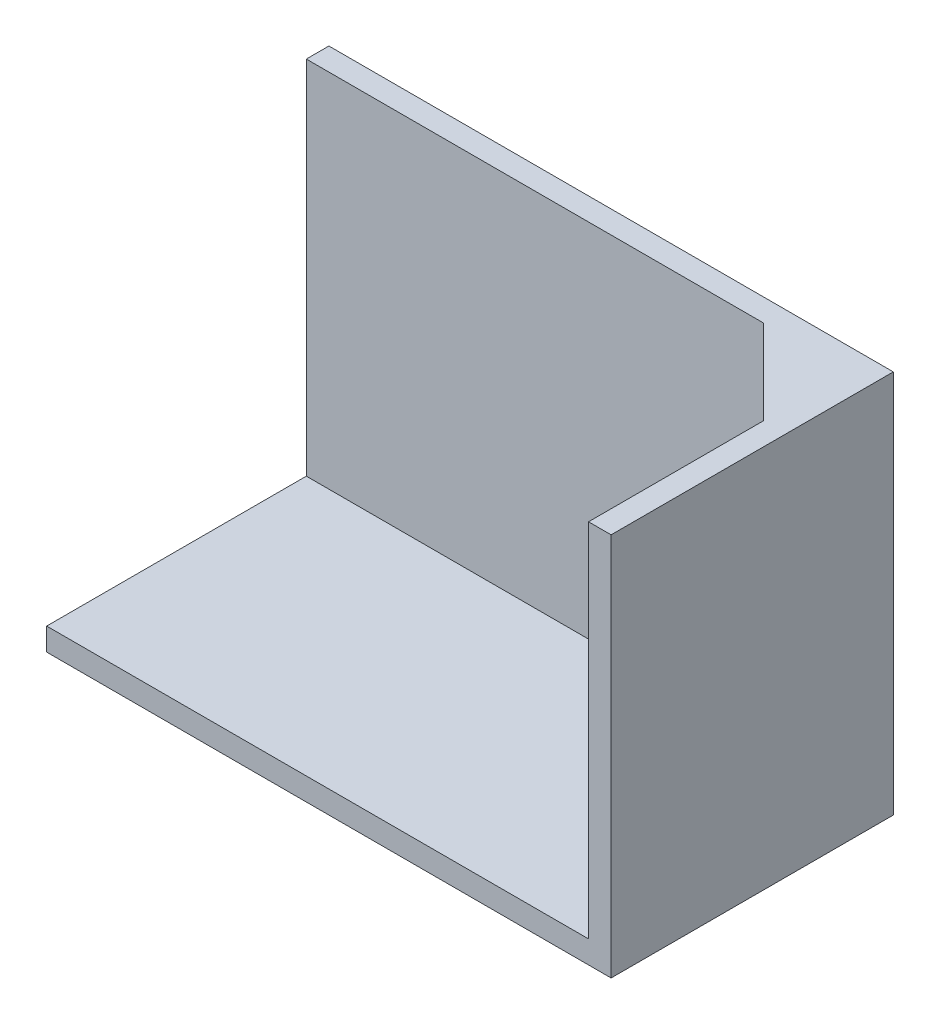
ISO-10303-21;
HEADER;
FILE_DESCRIPTION(('STEP AP214'),'2;1');
FILE_NAME('part.step','',(''),(''),'','','');
FILE_SCHEMA(('AUTOMOTIVE_DESIGN { 1 0 10303 214 1 1 1 1 }'));
ENDSEC;
DATA;
#1=APPLICATION_CONTEXT('core data for automotive mechanical design processes');
#2=APPLICATION_PROTOCOL_DEFINITION('international standard','automotive_design',2000,#1);
#3=PRODUCT_CONTEXT('',#1,'mechanical');
#4=PRODUCT('Part','Part','',(#3));
#5=PRODUCT_RELATED_PRODUCT_CATEGORY('part','',(#4));
#6=PRODUCT_DEFINITION_FORMATION('','',#4);
#7=PRODUCT_DEFINITION_CONTEXT('part definition',#1,'design');
#8=PRODUCT_DEFINITION('design','',#6,#7);
#9=PRODUCT_DEFINITION_SHAPE('','',#8);
#10=(LENGTH_UNIT() NAMED_UNIT(*) SI_UNIT(.MILLI.,.METRE.));
#11=(NAMED_UNIT(*) PLANE_ANGLE_UNIT() SI_UNIT($,.RADIAN.));
#12=(NAMED_UNIT(*) SI_UNIT($,.STERADIAN.) SOLID_ANGLE_UNIT());
#13=UNCERTAINTY_MEASURE_WITH_UNIT(LENGTH_MEASURE(1.E-05),#10,'distance_accuracy_value','');
#14=(GEOMETRIC_REPRESENTATION_CONTEXT(3) GLOBAL_UNCERTAINTY_ASSIGNED_CONTEXT((#13)) GLOBAL_UNIT_ASSIGNED_CONTEXT((#10,
#11,#12)) REPRESENTATION_CONTEXT('',''));
#15=CARTESIAN_POINT('',(0.,0.,0.));
#16=DIRECTION('',(0.,0.,1.));
#17=DIRECTION('',(1.,0.,0.));
#18=AXIS2_PLACEMENT_3D('',#15,#16,#17);
#19=CARTESIAN_POINT('',(0.,0.,0.));
#20=DIRECTION('',(0.,1.,0.));
#21=DIRECTION('',(0.,0.,1.));
#22=AXIS2_PLACEMENT_3D('',#19,#20,#21);
#23=PLANE('',#22);
#24=CARTESIAN_POINT('',(45.25,0.,-10.));
#25=DIRECTION('',(0.,1.,0.));
#26=DIRECTION('',(0.,0.,1.));
#27=AXIS2_PLACEMENT_3D('',#24,#25,#26);
#28=CIRCLE('',#27,3.25);
#29=CARTESIAN_POINT('',(45.25,0.,-6.74999999999994));
#30=VERTEX_POINT('',#29);
#31=CARTESIAN_POINT('',(45.25,0.,-13.25));
#32=VERTEX_POINT('',#31);
#33=EDGE_CURVE('E419',#30,#32,#28,.T.);
#34=ORIENTED_EDGE('',*,*,#33,.F.);
#35=DIRECTION('',(1.,0.,0.));
#36=VECTOR('',#35,1.);
#37=CARTESIAN_POINT('',(34.75,0.,-6.74999999999994));
#38=LINE('',#37,#36);
#39=CARTESIAN_POINT('',(34.75,0.,-6.75));
#40=VERTEX_POINT('',#39);
#41=EDGE_CURVE('E399',#40,#30,#38,.T.);
#42=ORIENTED_EDGE('',*,*,#41,.F.);
#43=CARTESIAN_POINT('',(34.75,0.,-10.));
#44=DIRECTION('',(0.,1.,0.));
#45=DIRECTION('',(0.,0.,1.));
#46=AXIS2_PLACEMENT_3D('',#43,#44,#45);
#47=CIRCLE('',#46,3.25);
#48=CARTESIAN_POINT('',(34.75,0.,-13.25));
#49=VERTEX_POINT('',#48);
#50=EDGE_CURVE('E409',#49,#40,#47,.T.);
#51=ORIENTED_EDGE('',*,*,#50,.F.);
#52=DIRECTION('',(1.,0.,0.));
#53=VECTOR('',#52,1.);
#54=CARTESIAN_POINT('',(34.75,0.,-13.25));
#55=LINE('',#54,#53);
#56=EDGE_CURVE('E406',#49,#32,#55,.T.);
#57=ORIENTED_EDGE('',*,*,#56,.T.);
#58=EDGE_LOOP('',(#34,#42,#51,#57));
#59=FACE_BOUND('',#58,.T.);
#60=DIRECTION('',(-0.707106781186552,0.,0.707106781186543));
#61=VECTOR('',#60,1.);
#62=CARTESIAN_POINT('',(17.4999999999999,0.,0.));
#63=LINE('',#62,#61);
#64=CARTESIAN_POINT('',(27.5,0.,-9.99999999999994));
#65=VERTEX_POINT('',#64);
#66=CARTESIAN_POINT('',(21.5,0.,-4.));
#67=VERTEX_POINT('',#66);
#68=EDGE_CURVE('E534',#65,#67,#63,.T.);
#69=ORIENTED_EDGE('',*,*,#68,.T.);
#70=DIRECTION('',(-1.,0.,0.));
#71=VECTOR('',#70,1.);
#72=CARTESIAN_POINT('',(0.,0.,-4.));
#73=LINE('',#72,#71);
#74=CARTESIAN_POINT('',(58.5,0.,-4.));
#75=VERTEX_POINT('',#74);
#76=EDGE_CURVE('E203',#67,#75,#73,.F.);
#77=ORIENTED_EDGE('',*,*,#76,.T.);
#78=DIRECTION('',(-0.707106781186544,0.,-0.707106781186551));
#79=VECTOR('',#78,1.);
#80=CARTESIAN_POINT('',(52.5,0.,-10.));
#81=LINE('',#80,#79);
#82=CARTESIAN_POINT('',(52.5,0.,-10.));
#83=VERTEX_POINT('',#82);
#84=EDGE_CURVE('E530',#75,#83,#81,.T.);
#85=ORIENTED_EDGE('',*,*,#84,.T.);
#86=DIRECTION('',(0.,0.,1.));
#87=VECTOR('',#86,1.);
#88=CARTESIAN_POINT('',(52.5,0.,0.));
#89=LINE('',#88,#87);
#90=CARTESIAN_POINT('',(52.5,0.,-33.));
#91=VERTEX_POINT('',#90);
#92=EDGE_CURVE('E430',#91,#83,#89,.T.);
#93=ORIENTED_EDGE('',*,*,#92,.F.);
#94=DIRECTION('',(0.707106781186545,0.,0.70710678118655));
#95=VECTOR('',#94,1.);
#96=CARTESIAN_POINT('',(42.7500000000002,0.,-42.7499999999999));
#97=LINE('',#96,#95);
#98=CARTESIAN_POINT('',(50.5,0.,-35.));
#99=VERTEX_POINT('',#98);
#100=EDGE_CURVE('E549',#91,#99,#97,.F.);
#101=ORIENTED_EDGE('',*,*,#100,.T.);
#102=DIRECTION('',(1.,0.,0.));
#103=VECTOR('',#102,1.);
#104=CARTESIAN_POINT('',(52.5,0.,-35.));
#105=LINE('',#104,#103);
#106=CARTESIAN_POINT('',(29.5,0.,-35.));
#107=VERTEX_POINT('',#106);
#108=EDGE_CURVE('E437',#107,#99,#105,.T.);
#109=ORIENTED_EDGE('',*,*,#108,.F.);
#110=DIRECTION('',(0.70710678118655,0.,-0.707106781186545));
#111=VECTOR('',#110,1.);
#112=CARTESIAN_POINT('',(-2.75000000000009,0.,-2.75000000000011));
#113=LINE('',#112,#111);
#114=CARTESIAN_POINT('',(27.5,0.,-33.));
#115=VERTEX_POINT('',#114);
#116=EDGE_CURVE('E547',#107,#115,#113,.F.);
#117=ORIENTED_EDGE('',*,*,#116,.T.);
#118=DIRECTION('',(0.,0.,-1.));
#119=VECTOR('',#118,1.);
#120=CARTESIAN_POINT('',(27.5,0.,0.));
#121=LINE('',#120,#119);
#122=EDGE_CURVE('E433',#65,#115,#121,.T.);
#123=ORIENTED_EDGE('',*,*,#122,.F.);
#124=EDGE_LOOP('',(#69,#77,#85,#93,#101,#109,#117,#123));
#125=FACE_BOUND('',#124,.T.);
#126=CARTESIAN_POINT('',(34.75,0.,-25.));
#127=DIRECTION('',(0.,1.,0.));
#128=DIRECTION('',(0.,0.,1.));
#129=AXIS2_PLACEMENT_3D('',#126,#127,#128);
#130=CIRCLE('',#129,3.25);
#131=CARTESIAN_POINT('',(34.75,0.,-28.25));
#132=VERTEX_POINT('',#131);
#133=CARTESIAN_POINT('',(34.75,0.,-21.75));
#134=VERTEX_POINT('',#133);
#135=EDGE_CURVE('E371',#132,#134,#130,.T.);
#136=ORIENTED_EDGE('',*,*,#135,.F.);
#137=DIRECTION('',(1.,0.,0.));
#138=VECTOR('',#137,1.);
#139=CARTESIAN_POINT('',(34.75,0.,-28.25));
#140=LINE('',#139,#138);
#141=CARTESIAN_POINT('',(45.25,0.,-28.25));
#142=VERTEX_POINT('',#141);
#143=EDGE_CURVE('E360',#132,#142,#140,.T.);
#144=ORIENTED_EDGE('',*,*,#143,.T.);
#145=CARTESIAN_POINT('',(45.25,0.,-25.));
#146=DIRECTION('',(0.,1.,0.));
#147=DIRECTION('',(0.,0.,1.));
#148=AXIS2_PLACEMENT_3D('',#145,#146,#147);
#149=CIRCLE('',#148,3.25);
#150=CARTESIAN_POINT('',(45.25,0.,-21.7499999999999));
#151=VERTEX_POINT('',#150);
#152=EDGE_CURVE('E381',#151,#142,#149,.T.);
#153=ORIENTED_EDGE('',*,*,#152,.F.);
#154=DIRECTION('',(1.,0.,0.));
#155=VECTOR('',#154,1.);
#156=CARTESIAN_POINT('',(34.75,0.,-21.7499999999999));
#157=LINE('',#156,#155);
#158=EDGE_CURVE('E385',#134,#151,#157,.T.);
#159=ORIENTED_EDGE('',*,*,#158,.F.);
#160=EDGE_LOOP('',(#136,#144,#153,#159));
#161=FACE_BOUND('',#160,.T.);
#162=ADVANCED_FACE('F188',(#59,#125,#161),#23,.T.);
#163=CARTESIAN_POINT('',(0.,64.,0.));
#164=DIRECTION('',(0.,0.,1.));
#165=DIRECTION('',(1.,0.,0.));
#166=AXIS2_PLACEMENT_3D('',#163,#164,#165);
#167=PLANE('',#166);
#168=DIRECTION('',(-1.,0.,0.));
#169=VECTOR('',#168,1.);
#170=CARTESIAN_POINT('',(0.,4.,0.));
#171=LINE('',#170,#169);
#172=CARTESIAN_POINT('',(62.4999999999999,4.,0.));
#173=VERTEX_POINT('',#172);
#174=CARTESIAN_POINT('',(17.4999999999999,4.,0.));
#175=VERTEX_POINT('',#174);
#176=EDGE_CURVE('E554',#173,#175,#171,.T.);
#177=ORIENTED_EDGE('',*,*,#176,.T.);
#178=DIRECTION('',(0.,-1.,0.));
#179=VECTOR('',#178,1.);
#180=CARTESIAN_POINT('',(17.4999999999999,64.,0.));
#181=LINE('',#180,#179);
#182=CARTESIAN_POINT('',(17.4999999999999,-4.,0.));
#183=VERTEX_POINT('',#182);
#184=EDGE_CURVE('E521',#175,#183,#181,.T.);
#185=ORIENTED_EDGE('',*,*,#184,.T.);
#186=DIRECTION('',(1.,0.,0.));
#187=VECTOR('',#186,1.);
#188=CARTESIAN_POINT('',(0.,-4.,0.));
#189=LINE('',#188,#187);
#190=CARTESIAN_POINT('',(0.,-4.,0.));
#191=VERTEX_POINT('',#190);
#192=EDGE_CURVE('E469',#191,#183,#189,.T.);
#193=ORIENTED_EDGE('',*,*,#192,.F.);
#194=DIRECTION('',(0.,-1.,0.));
#195=VECTOR('',#194,1.);
#196=CARTESIAN_POINT('',(0.,64.,0.));
#197=LINE('',#196,#195);
#198=CARTESIAN_POINT('',(0.,64.,0.));
#199=VERTEX_POINT('',#198);
#200=EDGE_CURVE('E499',#199,#191,#197,.T.);
#201=ORIENTED_EDGE('',*,*,#200,.F.);
#202=DIRECTION('',(-1.,0.,0.));
#203=VECTOR('',#202,1.);
#204=CARTESIAN_POINT('',(0.,64.,0.));
#205=LINE('',#204,#203);
#206=CARTESIAN_POINT('',(100.,64.,0.));
#207=VERTEX_POINT('',#206);
#208=EDGE_CURVE('E497',#207,#199,#205,.T.);
#209=ORIENTED_EDGE('',*,*,#208,.F.);
#210=DIRECTION('',(0.,-1.,0.));
#211=VECTOR('',#210,1.);
#212=CARTESIAN_POINT('',(100.,64.,0.));
#213=LINE('',#212,#211);
#214=CARTESIAN_POINT('',(100.,-4.,0.));
#215=VERTEX_POINT('',#214);
#216=EDGE_CURVE('E505',#207,#215,#213,.T.);
#217=ORIENTED_EDGE('',*,*,#216,.T.);
#218=CARTESIAN_POINT('',(62.4999999999999,-4.,0.));
#219=VERTEX_POINT('',#218);
#220=EDGE_CURVE('E467',#219,#215,#189,.T.);
#221=ORIENTED_EDGE('',*,*,#220,.F.);
#222=DIRECTION('',(0.,1.,0.));
#223=VECTOR('',#222,1.);
#224=CARTESIAN_POINT('',(62.4999999999999,64.,0.));
#225=LINE('',#224,#223);
#226=EDGE_CURVE('E524',#219,#173,#225,.T.);
#227=ORIENTED_EDGE('',*,*,#226,.T.);
#228=EDGE_LOOP('',(#177,#185,#193,#201,#209,#217,#221,#227));
#229=FACE_BOUND('',#228,.T.);
#230=ADVANCED_FACE('F559',(#229),#167,.F.);
#231=CARTESIAN_POINT('',(0.,64.,4.));
#232=DIRECTION('',(1.,0.,0.));
#233=DIRECTION('',(0.,0.,-1.));
#234=AXIS2_PLACEMENT_3D('',#231,#232,#233);
#235=PLANE('',#234);
#236=ORIENTED_EDGE('',*,*,#200,.T.);
#237=DIRECTION('',(0.,0.,-1.));
#238=VECTOR('',#237,1.);
#239=CARTESIAN_POINT('',(0.,-4.,0.));
#240=LINE('',#239,#238);
#241=CARTESIAN_POINT('',(0.,-4.,50.));
#242=VERTEX_POINT('',#241);
#243=EDGE_CURVE('E464',#242,#191,#240,.T.);
#244=ORIENTED_EDGE('',*,*,#243,.F.);
#245=DIRECTION('',(0.,1.,0.));
#246=VECTOR('',#245,1.);
#247=CARTESIAN_POINT('',(0.,-4.,50.));
#248=LINE('',#247,#246);
#249=CARTESIAN_POINT('',(0.,0.,50.));
#250=VERTEX_POINT('',#249);
#251=EDGE_CURVE('E477',#242,#250,#248,.T.);
#252=ORIENTED_EDGE('',*,*,#251,.T.);
#253=DIRECTION('',(0.,0.,-1.));
#254=VECTOR('',#253,1.);
#255=CARTESIAN_POINT('',(0.,0.,0.));
#256=LINE('',#255,#254);
#257=CARTESIAN_POINT('',(0.,0.,3.99999999999999));
#258=VERTEX_POINT('',#257);
#259=EDGE_CURVE('E461',#250,#258,#256,.T.);
#260=ORIENTED_EDGE('',*,*,#259,.T.);
#261=DIRECTION('',(0.,-1.,0.));
#262=VECTOR('',#261,1.);
#263=CARTESIAN_POINT('',(0.,64.,4.));
#264=LINE('',#263,#262);
#265=CARTESIAN_POINT('',(0.,64.,4.));
#266=VERTEX_POINT('',#265);
#267=EDGE_CURVE('E515',#266,#258,#264,.T.);
#268=ORIENTED_EDGE('',*,*,#267,.F.);
#269=DIRECTION('',(0.,0.,1.));
#270=VECTOR('',#269,1.);
#271=CARTESIAN_POINT('',(0.,64.,4.));
#272=LINE('',#271,#270);
#273=EDGE_CURVE('E484',#199,#266,#272,.T.);
#274=ORIENTED_EDGE('',*,*,#273,.F.);
#275=EDGE_LOOP('',(#236,#244,#252,#260,#268,#274));
#276=FACE_BOUND('',#275,.T.);
#277=ADVANCED_FACE('F601',(#276),#235,.F.);
#278=CARTESIAN_POINT('',(96.,64.,3.99999999999998));
#279=DIRECTION('',(0.,0.,-1.));
#280=DIRECTION('',(-1.,0.,0.));
#281=AXIS2_PLACEMENT_3D('',#278,#279,#280);
#282=PLANE('',#281);
#283=DIRECTION('',(-1.,0.,0.));
#284=VECTOR('',#283,1.);
#285=CARTESIAN_POINT('',(96.,60.,3.99999999999998));
#286=LINE('',#285,#284);
#287=CARTESIAN_POINT('',(96.,60.,3.99999999999998));
#288=VERTEX_POINT('',#287);
#289=CARTESIAN_POINT('',(81.,60.,4.));
#290=VERTEX_POINT('',#289);
#291=EDGE_CURVE('E450',#288,#290,#286,.T.);
#292=ORIENTED_EDGE('',*,*,#291,.T.);
#293=DIRECTION('',(0.,1.,0.));
#294=VECTOR('',#293,1.);
#295=CARTESIAN_POINT('',(81.,60.,4.));
#296=LINE('',#295,#294);
#297=CARTESIAN_POINT('',(81.,64.,4.));
#298=VERTEX_POINT('',#297);
#299=EDGE_CURVE('E456',#290,#298,#296,.T.);
#300=ORIENTED_EDGE('',*,*,#299,.T.);
#301=DIRECTION('',(1.,0.,0.));
#302=VECTOR('',#301,1.);
#303=CARTESIAN_POINT('',(96.,64.,3.99999999999998));
#304=LINE('',#303,#302);
#305=EDGE_CURVE('E487',#266,#298,#304,.T.);
#306=ORIENTED_EDGE('',*,*,#305,.F.);
#307=ORIENTED_EDGE('',*,*,#267,.T.);
#308=DIRECTION('',(1.,0.,0.));
#309=VECTOR('',#308,1.);
#310=CARTESIAN_POINT('',(96.,0.,3.99999999999998));
#311=LINE('',#310,#309);
#312=CARTESIAN_POINT('',(96.,0.,3.99999999999998));
#313=VERTEX_POINT('',#312);
#314=EDGE_CURVE('E483',#258,#313,#311,.T.);
#315=ORIENTED_EDGE('',*,*,#314,.T.);
#316=DIRECTION('',(0.,-1.,0.));
#317=VECTOR('',#316,1.);
#318=CARTESIAN_POINT('',(96.,64.,3.99999999999998));
#319=LINE('',#318,#317);
#320=EDGE_CURVE('E513',#288,#313,#319,.T.);
#321=ORIENTED_EDGE('',*,*,#320,.F.);
#322=EDGE_LOOP('',(#292,#300,#306,#307,#315,#321));
#323=FACE_BOUND('',#322,.T.);
#324=ADVANCED_FACE('F621',(#323),#282,.F.);
#325=CARTESIAN_POINT('',(96.,64.,50.));
#326=DIRECTION('',(1.,0.,0.));
#327=DIRECTION('',(0.,0.,-1.));
#328=AXIS2_PLACEMENT_3D('',#325,#326,#327);
#329=PLANE('',#328);
#330=DIRECTION('',(0.,0.,1.));
#331=VECTOR('',#330,1.);
#332=CARTESIAN_POINT('',(96.,64.,50.));
#333=LINE('',#332,#331);
#334=CARTESIAN_POINT('',(96.,64.,19.));
#335=VERTEX_POINT('',#334);
#336=CARTESIAN_POINT('',(96.,64.,50.));
#337=VERTEX_POINT('',#336);
#338=EDGE_CURVE('E491',#335,#337,#333,.T.);
#339=ORIENTED_EDGE('',*,*,#338,.F.);
#340=DIRECTION('',(0.,1.,0.));
#341=VECTOR('',#340,1.);
#342=CARTESIAN_POINT('',(96.,60.,19.));
#343=LINE('',#342,#341);
#344=CARTESIAN_POINT('',(96.,60.,19.));
#345=VERTEX_POINT('',#344);
#346=EDGE_CURVE('E459',#345,#335,#343,.T.);
#347=ORIENTED_EDGE('',*,*,#346,.F.);
#348=DIRECTION('',(0.,0.,-1.));
#349=VECTOR('',#348,1.);
#350=CARTESIAN_POINT('',(96.,60.,19.));
#351=LINE('',#350,#349);
#352=EDGE_CURVE('E447',#345,#288,#351,.T.);
#353=ORIENTED_EDGE('',*,*,#352,.T.);
#354=ORIENTED_EDGE('',*,*,#320,.T.);
#355=DIRECTION('',(0.,0.,1.));
#356=VECTOR('',#355,1.);
#357=CARTESIAN_POINT('',(96.,0.,50.));
#358=LINE('',#357,#356);
#359=CARTESIAN_POINT('',(96.,0.,50.));
#360=VERTEX_POINT('',#359);
#361=EDGE_CURVE('E488',#313,#360,#358,.T.);
#362=ORIENTED_EDGE('',*,*,#361,.T.);
#363=DIRECTION('',(0.,-1.,0.));
#364=VECTOR('',#363,1.);
#365=CARTESIAN_POINT('',(96.,64.,50.));
#366=LINE('',#365,#364);
#367=EDGE_CURVE('E510',#337,#360,#366,.T.);
#368=ORIENTED_EDGE('',*,*,#367,.F.);
#369=EDGE_LOOP('',(#339,#347,#353,#354,#362,#368));
#370=FACE_BOUND('',#369,.T.);
#371=ADVANCED_FACE('F630',(#370),#329,.F.);
#372=CARTESIAN_POINT('',(100.,64.,50.));
#373=DIRECTION('',(0.,0.,-1.));
#374=DIRECTION('',(-1.,0.,0.));
#375=AXIS2_PLACEMENT_3D('',#372,#373,#374);
#376=PLANE('',#375);
#377=ORIENTED_EDGE('',*,*,#367,.T.);
#378=DIRECTION('',(-1.,0.,0.));
#379=VECTOR('',#378,1.);
#380=CARTESIAN_POINT('',(0.,0.,50.));
#381=LINE('',#380,#379);
#382=EDGE_CURVE('E468',#360,#250,#381,.T.);
#383=ORIENTED_EDGE('',*,*,#382,.T.);
#384=ORIENTED_EDGE('',*,*,#251,.F.);
#385=DIRECTION('',(-1.,0.,0.));
#386=VECTOR('',#385,1.);
#387=CARTESIAN_POINT('',(0.,-4.,50.));
#388=LINE('',#387,#386);
#389=CARTESIAN_POINT('',(100.,-4.,50.));
#390=VERTEX_POINT('',#389);
#391=EDGE_CURVE('E475',#390,#242,#388,.T.);
#392=ORIENTED_EDGE('',*,*,#391,.F.);
#393=DIRECTION('',(0.,-1.,0.));
#394=VECTOR('',#393,1.);
#395=CARTESIAN_POINT('',(100.,64.,50.));
#396=LINE('',#395,#394);
#397=CARTESIAN_POINT('',(100.,64.,50.));
#398=VERTEX_POINT('',#397);
#399=EDGE_CURVE('E508',#398,#390,#396,.T.);
#400=ORIENTED_EDGE('',*,*,#399,.F.);
#401=DIRECTION('',(1.,0.,0.));
#402=VECTOR('',#401,1.);
#403=CARTESIAN_POINT('',(100.,64.,50.));
#404=LINE('',#403,#402);
#405=EDGE_CURVE('E493',#337,#398,#404,.T.);
#406=ORIENTED_EDGE('',*,*,#405,.F.);
#407=EDGE_LOOP('',(#377,#383,#384,#392,#400,#406));
#408=FACE_BOUND('',#407,.T.);
#409=ADVANCED_FACE('F614',(#408),#376,.F.);
#410=CARTESIAN_POINT('',(100.,64.,0.));
#411=DIRECTION('',(-1.,0.,0.));
#412=DIRECTION('',(0.,0.,1.));
#413=AXIS2_PLACEMENT_3D('',#410,#411,#412);
#414=PLANE('',#413);
#415=ORIENTED_EDGE('',*,*,#399,.T.);
#416=DIRECTION('',(0.,0.,1.));
#417=VECTOR('',#416,1.);
#418=CARTESIAN_POINT('',(100.,-4.,0.));
#419=LINE('',#418,#417);
#420=EDGE_CURVE('E472',#215,#390,#419,.T.);
#421=ORIENTED_EDGE('',*,*,#420,.F.);
#422=ORIENTED_EDGE('',*,*,#216,.F.);
#423=DIRECTION('',(0.,0.,-1.));
#424=VECTOR('',#423,1.);
#425=CARTESIAN_POINT('',(100.,64.,0.));
#426=LINE('',#425,#424);
#427=EDGE_CURVE('E495',#398,#207,#426,.T.);
#428=ORIENTED_EDGE('',*,*,#427,.F.);
#429=EDGE_LOOP('',(#415,#421,#422,#428));
#430=FACE_BOUND('',#429,.T.);
#431=ADVANCED_FACE('F610',(#430),#414,.F.);
#432=CARTESIAN_POINT('',(0.,64.,0.));
#433=DIRECTION('',(0.,-1.,0.));
#434=DIRECTION('',(0.,0.,-1.));
#435=AXIS2_PLACEMENT_3D('',#432,#433,#434);
#436=PLANE('',#435);
#437=DIRECTION('',(0.707106781186548,0.,0.707106781186547));
#438=VECTOR('',#437,1.);
#439=CARTESIAN_POINT('',(81.,64.,4.));
#440=LINE('',#439,#438);
#441=EDGE_CURVE('E440',#298,#335,#440,.T.);
#442=ORIENTED_EDGE('',*,*,#441,.T.);
#443=ORIENTED_EDGE('',*,*,#338,.T.);
#444=ORIENTED_EDGE('',*,*,#405,.T.);
#445=ORIENTED_EDGE('',*,*,#427,.T.);
#446=ORIENTED_EDGE('',*,*,#208,.T.);
#447=ORIENTED_EDGE('',*,*,#273,.T.);
#448=ORIENTED_EDGE('',*,*,#305,.T.);
#449=EDGE_LOOP('',(#442,#443,#444,#445,#446,#447,#448));
#450=FACE_BOUND('',#449,.T.);
#451=ADVANCED_FACE('F603',(#450),#436,.F.);
#452=CARTESIAN_POINT('',(0.,0.,0.));
#453=DIRECTION('',(0.,1.,0.));
#454=DIRECTION('',(0.,0.,1.));
#455=AXIS2_PLACEMENT_3D('',#452,#453,#454);
#456=PLANE('',#455);
#457=ORIENTED_EDGE('',*,*,#361,.F.);
#458=ORIENTED_EDGE('',*,*,#314,.F.);
#459=ORIENTED_EDGE('',*,*,#259,.F.);
#460=ORIENTED_EDGE('',*,*,#382,.F.);
#461=EDGE_LOOP('',(#457,#458,#459,#460));
#462=FACE_BOUND('',#461,.T.);
#463=ADVANCED_FACE('F618',(#462),#456,.T.);
#464=CARTESIAN_POINT('',(0.,-4.,0.));
#465=DIRECTION('',(0.,1.,0.));
#466=DIRECTION('',(0.,0.,1.));
#467=AXIS2_PLACEMENT_3D('',#464,#465,#466);
#468=PLANE('',#467);
#469=CARTESIAN_POINT('',(45.25,-4.,-25.));
#470=DIRECTION('',(0.,1.,0.));
#471=DIRECTION('',(0.,0.,1.));
#472=AXIS2_PLACEMENT_3D('',#469,#470,#471);
#473=CIRCLE('',#472,3.25);
#474=CARTESIAN_POINT('',(45.25,-4.,-21.75));
#475=VERTEX_POINT('',#474);
#476=CARTESIAN_POINT('',(45.25,-4.,-28.25));
#477=VERTEX_POINT('',#476);
#478=EDGE_CURVE('E392',#475,#477,#473,.T.);
#479=ORIENTED_EDGE('',*,*,#478,.T.);
#480=DIRECTION('',(1.,0.,0.));
#481=VECTOR('',#480,1.);
#482=CARTESIAN_POINT('',(34.75,-4.,-28.25));
#483=LINE('',#482,#481);
#484=CARTESIAN_POINT('',(34.75,-4.,-28.25));
#485=VERTEX_POINT('',#484);
#486=EDGE_CURVE('E372',#485,#477,#483,.T.);
#487=ORIENTED_EDGE('',*,*,#486,.F.);
#488=CARTESIAN_POINT('',(34.75,-4.,-25.));
#489=DIRECTION('',(0.,1.,0.));
#490=DIRECTION('',(0.,0.,1.));
#491=AXIS2_PLACEMENT_3D('',#488,#489,#490);
#492=CIRCLE('',#491,3.25);
#493=CARTESIAN_POINT('',(34.75,-4.,-21.75));
#494=VERTEX_POINT('',#493);
#495=EDGE_CURVE('E379',#485,#494,#492,.T.);
#496=ORIENTED_EDGE('',*,*,#495,.T.);
#497=DIRECTION('',(1.,0.,0.));
#498=VECTOR('',#497,1.);
#499=CARTESIAN_POINT('',(34.75,-4.,-21.75));
#500=LINE('',#499,#498);
#501=EDGE_CURVE('E788',#494,#475,#500,.T.);
#502=ORIENTED_EDGE('',*,*,#501,.T.);
#503=EDGE_LOOP('',(#479,#487,#496,#502));
#504=FACE_BOUND('',#503,.T.);
#505=DIRECTION('',(1.,0.,0.));
#506=VECTOR('',#505,1.);
#507=CARTESIAN_POINT('',(34.75,-4.,-6.75));
#508=LINE('',#507,#506);
#509=CARTESIAN_POINT('',(34.75,-4.,-6.75));
#510=VERTEX_POINT('',#509);
#511=CARTESIAN_POINT('',(45.25,-4.,-6.75));
#512=VERTEX_POINT('',#511);
#513=EDGE_CURVE('E401',#510,#512,#508,.T.);
#514=ORIENTED_EDGE('',*,*,#513,.T.);
#515=CARTESIAN_POINT('',(45.25,-4.,-10.));
#516=DIRECTION('',(0.,1.,0.));
#517=DIRECTION('',(0.,0.,1.));
#518=AXIS2_PLACEMENT_3D('',#515,#516,#517);
#519=CIRCLE('',#518,3.25);
#520=CARTESIAN_POINT('',(45.25,-4.,-13.25));
#521=VERTEX_POINT('',#520);
#522=EDGE_CURVE('E422',#512,#521,#519,.T.);
#523=ORIENTED_EDGE('',*,*,#522,.T.);
#524=DIRECTION('',(1.,0.,0.));
#525=VECTOR('',#524,1.);
#526=CARTESIAN_POINT('',(34.75,-4.,-13.25));
#527=LINE('',#526,#525);
#528=CARTESIAN_POINT('',(34.75,-4.,-13.25));
#529=VERTEX_POINT('',#528);
#530=EDGE_CURVE('E404',#529,#521,#527,.T.);
#531=ORIENTED_EDGE('',*,*,#530,.F.);
#532=CARTESIAN_POINT('',(34.75,-4.,-10.));
#533=DIRECTION('',(0.,1.,0.));
#534=DIRECTION('',(0.,0.,1.));
#535=AXIS2_PLACEMENT_3D('',#532,#533,#534);
#536=CIRCLE('',#535,3.25);
#537=EDGE_CURVE('E412',#529,#510,#536,.T.);
#538=ORIENTED_EDGE('',*,*,#537,.T.);
#539=EDGE_LOOP('',(#514,#523,#531,#538));
#540=FACE_BOUND('',#539,.T.);
#541=DIRECTION('',(1.,0.,0.));
#542=VECTOR('',#541,1.);
#543=CARTESIAN_POINT('',(52.5,-4.,-35.));
#544=LINE('',#543,#542);
#545=CARTESIAN_POINT('',(29.5,-4.,-35.));
#546=VERTEX_POINT('',#545);
#547=CARTESIAN_POINT('',(50.5,-4.,-35.));
#548=VERTEX_POINT('',#547);
#549=EDGE_CURVE('E434',#546,#548,#544,.T.);
#550=ORIENTED_EDGE('',*,*,#549,.T.);
#551=DIRECTION('',(-0.707106781186545,0.,-0.70710678118655));
#552=VECTOR('',#551,1.);
#553=CARTESIAN_POINT('',(50.5,-4.,-35.));
#554=LINE('',#553,#552);
#555=CARTESIAN_POINT('',(52.5,-4.,-33.));
#556=VERTEX_POINT('',#555);
#557=EDGE_CURVE('E543',#548,#556,#554,.F.);
#558=ORIENTED_EDGE('',*,*,#557,.T.);
#559=DIRECTION('',(0.,0.,1.));
#560=VECTOR('',#559,1.);
#561=CARTESIAN_POINT('',(52.5,-4.,0.));
#562=LINE('',#561,#560);
#563=CARTESIAN_POINT('',(52.5,-4.,-10.));
#564=VERTEX_POINT('',#563);
#565=EDGE_CURVE('E429',#556,#564,#562,.T.);
#566=ORIENTED_EDGE('',*,*,#565,.T.);
#567=DIRECTION('',(0.707106781186544,0.,0.707106781186551));
#568=VECTOR('',#567,1.);
#569=CARTESIAN_POINT('',(31.2500000000003,-4.,-31.25));
#570=LINE('',#569,#568);
#571=EDGE_CURVE('E528',#564,#219,#570,.T.);
#572=ORIENTED_EDGE('',*,*,#571,.T.);
#573=ORIENTED_EDGE('',*,*,#220,.T.);
#574=ORIENTED_EDGE('',*,*,#420,.T.);
#575=ORIENTED_EDGE('',*,*,#391,.T.);
#576=ORIENTED_EDGE('',*,*,#243,.T.);
#577=ORIENTED_EDGE('',*,*,#192,.T.);
#578=DIRECTION('',(0.707106781186552,0.,-0.707106781186543));
#579=VECTOR('',#578,1.);
#580=CARTESIAN_POINT('',(8.74999999999986,-4.,8.74999999999997));
#581=LINE('',#580,#579);
#582=CARTESIAN_POINT('',(27.5,-4.,-9.99999999999994));
#583=VERTEX_POINT('',#582);
#584=EDGE_CURVE('E532',#183,#583,#581,.T.);
#585=ORIENTED_EDGE('',*,*,#584,.T.);
#586=DIRECTION('',(0.,0.,-1.));
#587=VECTOR('',#586,1.);
#588=CARTESIAN_POINT('',(27.5,-4.,0.));
#589=LINE('',#588,#587);
#590=CARTESIAN_POINT('',(27.5,-4.,-33.));
#591=VERTEX_POINT('',#590);
#592=EDGE_CURVE('E442',#583,#591,#589,.T.);
#593=ORIENTED_EDGE('',*,*,#592,.T.);
#594=DIRECTION('',(-0.70710678118655,0.,0.707106781186545));
#595=VECTOR('',#594,1.);
#596=CARTESIAN_POINT('',(27.5,-4.,-33.));
#597=LINE('',#596,#595);
#598=EDGE_CURVE('E541',#591,#546,#597,.F.);
#599=ORIENTED_EDGE('',*,*,#598,.T.);
#600=EDGE_LOOP('',(#550,#558,#566,#572,#573,#574,#575,#576,#577,#585,#593,#599));
#601=FACE_BOUND('',#600,.T.);
#602=ADVANCED_FACE('F594',(#504,#540,#601),#468,.F.);
#603=CARTESIAN_POINT('',(81.,60.,4.));
#604=DIRECTION('',(-0.707106781186547,0.,0.707106781186548));
#605=DIRECTION('',(0.707106781186548,0.,0.707106781186547));
#606=AXIS2_PLACEMENT_3D('',#603,#604,#605);
#607=PLANE('',#606);
#608=ORIENTED_EDGE('',*,*,#441,.F.);
#609=ORIENTED_EDGE('',*,*,#299,.F.);
#610=DIRECTION('',(0.707106781186548,0.,0.707106781186547));
#611=VECTOR('',#610,1.);
#612=CARTESIAN_POINT('',(81.,60.,4.));
#613=LINE('',#612,#611);
#614=EDGE_CURVE('E453',#290,#345,#613,.T.);
#615=ORIENTED_EDGE('',*,*,#614,.T.);
#616=ORIENTED_EDGE('',*,*,#346,.T.);
#617=EDGE_LOOP('',(#608,#609,#615,#616));
#618=FACE_BOUND('',#617,.T.);
#619=ADVANCED_FACE('F624',(#618),#607,.T.);
#620=CARTESIAN_POINT('',(0.,60.,0.));
#621=DIRECTION('',(0.,1.,0.));
#622=DIRECTION('',(0.,0.,1.));
#623=AXIS2_PLACEMENT_3D('',#620,#621,#622);
#624=PLANE('',#623);
#625=ORIENTED_EDGE('',*,*,#352,.F.);
#626=ORIENTED_EDGE('',*,*,#614,.F.);
#627=ORIENTED_EDGE('',*,*,#291,.F.);
#628=EDGE_LOOP('',(#625,#626,#627));
#629=FACE_BOUND('',#628,.T.);
#630=ADVANCED_FACE('F627',(#629),#624,.F.);
#631=CARTESIAN_POINT('',(52.5,0.,0.));
#632=DIRECTION('',(1.,0.,0.));
#633=DIRECTION('',(0.,0.,-1.));
#634=AXIS2_PLACEMENT_3D('',#631,#632,#633);
#635=PLANE('',#634);
#636=ORIENTED_EDGE('',*,*,#565,.F.);
#637=DIRECTION('',(0.,1.,0.));
#638=VECTOR('',#637,1.);
#639=CARTESIAN_POINT('',(52.5,0.,-33.));
#640=LINE('',#639,#638);
#641=EDGE_CURVE('E545',#556,#91,#640,.T.);
#642=ORIENTED_EDGE('',*,*,#641,.T.);
#643=ORIENTED_EDGE('',*,*,#92,.T.);
#644=DIRECTION('',(0.,-1.,0.));
#645=VECTOR('',#644,1.);
#646=CARTESIAN_POINT('',(52.5,0.,-10.));
#647=LINE('',#646,#645);
#648=EDGE_CURVE('E518',#83,#564,#647,.T.);
#649=ORIENTED_EDGE('',*,*,#648,.T.);
#650=EDGE_LOOP('',(#636,#642,#643,#649));
#651=FACE_BOUND('',#650,.T.);
#652=ADVANCED_FACE('F573',(#651),#635,.T.);
#653=CARTESIAN_POINT('',(52.5,0.,-35.));
#654=DIRECTION('',(0.,0.,-1.));
#655=DIRECTION('',(-1.,0.,0.));
#656=AXIS2_PLACEMENT_3D('',#653,#654,#655);
#657=PLANE('',#656);
#658=ORIENTED_EDGE('',*,*,#108,.T.);
#659=DIRECTION('',(0.,-1.,0.));
#660=VECTOR('',#659,1.);
#661=CARTESIAN_POINT('',(50.5,0.,-35.));
#662=LINE('',#661,#660);
#663=EDGE_CURVE('E538',#99,#548,#662,.T.);
#664=ORIENTED_EDGE('',*,*,#663,.T.);
#665=ORIENTED_EDGE('',*,*,#549,.F.);
#666=DIRECTION('',(0.,1.,0.));
#667=VECTOR('',#666,1.);
#668=CARTESIAN_POINT('',(29.5,0.,-35.));
#669=LINE('',#668,#667);
#670=EDGE_CURVE('E536',#546,#107,#669,.T.);
#671=ORIENTED_EDGE('',*,*,#670,.T.);
#672=EDGE_LOOP('',(#658,#664,#665,#671));
#673=FACE_BOUND('',#672,.T.);
#674=ADVANCED_FACE('F581',(#673),#657,.T.);
#675=CARTESIAN_POINT('',(27.5,0.,0.));
#676=DIRECTION('',(-1.,0.,0.));
#677=DIRECTION('',(0.,0.,1.));
#678=AXIS2_PLACEMENT_3D('',#675,#676,#677);
#679=PLANE('',#678);
#680=ORIENTED_EDGE('',*,*,#122,.T.);
#681=DIRECTION('',(0.,-1.,0.));
#682=VECTOR('',#681,1.);
#683=CARTESIAN_POINT('',(27.5,0.,-33.));
#684=LINE('',#683,#682);
#685=EDGE_CURVE('E551',#115,#591,#684,.T.);
#686=ORIENTED_EDGE('',*,*,#685,.T.);
#687=ORIENTED_EDGE('',*,*,#592,.F.);
#688=DIRECTION('',(0.,1.,0.));
#689=VECTOR('',#688,1.);
#690=CARTESIAN_POINT('',(27.5,0.,-9.99999999999994));
#691=LINE('',#690,#689);
#692=EDGE_CURVE('E526',#583,#65,#691,.T.);
#693=ORIENTED_EDGE('',*,*,#692,.T.);
#694=EDGE_LOOP('',(#680,#686,#687,#693));
#695=FACE_BOUND('',#694,.T.);
#696=ADVANCED_FACE('F589',(#695),#679,.T.);
#697=CARTESIAN_POINT('',(52.5,0.,-10.));
#698=DIRECTION('',(-0.707106781186551,0.,0.707106781186544));
#699=DIRECTION('',(0.,-1.,0.));
#700=AXIS2_PLACEMENT_3D('',#697,#698,#699);
#701=PLANE('',#700);
#702=ORIENTED_EDGE('',*,*,#84,.F.);
#703=CARTESIAN_POINT('',(58.5,4.,-4.));
#704=DIRECTION('',(-0.707106781186551,0.,0.707106781186544));
#705=DIRECTION('',(-0.707106781186544,0.,-0.707106781186551));
#706=AXIS2_PLACEMENT_3D('',#703,#704,#705);
#707=ELLIPSE('',#706,5.65685424949235,4.);
#708=EDGE_CURVE('E13',#75,#173,#707,.T.);
#709=ORIENTED_EDGE('',*,*,#708,.T.);
#710=ORIENTED_EDGE('',*,*,#226,.F.);
#711=ORIENTED_EDGE('',*,*,#571,.F.);
#712=ORIENTED_EDGE('',*,*,#648,.F.);
#713=EDGE_LOOP('',(#702,#709,#710,#711,#712));
#714=FACE_BOUND('',#713,.T.);
#715=ADVANCED_FACE('F566',(#714),#701,.F.);
#716=CARTESIAN_POINT('',(17.4999999999999,64.,0.));
#717=DIRECTION('',(0.707106781186543,0.,0.707106781186552));
#718=DIRECTION('',(0.,-1.,0.));
#719=AXIS2_PLACEMENT_3D('',#716,#717,#718);
#720=PLANE('',#719);
#721=ORIENTED_EDGE('',*,*,#68,.F.);
#722=ORIENTED_EDGE('',*,*,#692,.F.);
#723=ORIENTED_EDGE('',*,*,#584,.F.);
#724=ORIENTED_EDGE('',*,*,#184,.F.);
#725=CARTESIAN_POINT('',(21.5,4.,-4.));
#726=DIRECTION('',(0.707106781186543,0.,0.707106781186552));
#727=DIRECTION('',(-0.707106781186552,0.,0.707106781186543));
#728=AXIS2_PLACEMENT_3D('',#725,#726,#727);
#729=ELLIPSE('',#728,5.65685424949242,4.);
#730=EDGE_CURVE('E196',#175,#67,#729,.T.);
#731=ORIENTED_EDGE('',*,*,#730,.T.);
#732=EDGE_LOOP('',(#721,#722,#723,#724,#731));
#733=FACE_BOUND('',#732,.T.);
#734=ADVANCED_FACE('F592',(#733),#720,.F.);
#735=CARTESIAN_POINT('',(50.5,0.,-35.));
#736=DIRECTION('',(-0.70710678118655,0.,0.707106781186545));
#737=DIRECTION('',(0.,-1.,0.));
#738=AXIS2_PLACEMENT_3D('',#735,#736,#737);
#739=PLANE('',#738);
#740=ORIENTED_EDGE('',*,*,#100,.F.);
#741=ORIENTED_EDGE('',*,*,#641,.F.);
#742=ORIENTED_EDGE('',*,*,#557,.F.);
#743=ORIENTED_EDGE('',*,*,#663,.F.);
#744=EDGE_LOOP('',(#740,#741,#742,#743));
#745=FACE_BOUND('',#744,.T.);
#746=ADVANCED_FACE('F576',(#745),#739,.F.);
#747=CARTESIAN_POINT('',(27.5,0.,-33.));
#748=DIRECTION('',(0.707106781186545,0.,0.70710678118655));
#749=DIRECTION('',(0.,-1.,0.));
#750=AXIS2_PLACEMENT_3D('',#747,#748,#749);
#751=PLANE('',#750);
#752=ORIENTED_EDGE('',*,*,#116,.F.);
#753=ORIENTED_EDGE('',*,*,#670,.F.);
#754=ORIENTED_EDGE('',*,*,#598,.F.);
#755=ORIENTED_EDGE('',*,*,#685,.F.);
#756=EDGE_LOOP('',(#752,#753,#754,#755));
#757=FACE_BOUND('',#756,.T.);
#758=ADVANCED_FACE('F585',(#757),#751,.F.);
#759=CARTESIAN_POINT('',(45.25,0.,-10.));
#760=DIRECTION('',(0.,1.,0.));
#761=DIRECTION('',(0.,0.,1.));
#762=AXIS2_PLACEMENT_3D('',#759,#760,#761);
#763=CYLINDRICAL_SURFACE('',#762,3.25);
#764=ORIENTED_EDGE('',*,*,#522,.F.);
#765=DIRECTION('',(0.,1.,0.));
#766=VECTOR('',#765,1.);
#767=CARTESIAN_POINT('',(45.25,0.,-6.75));
#768=LINE('',#767,#766);
#769=EDGE_CURVE('E427',#30,#512,#768,.F.);
#770=ORIENTED_EDGE('',*,*,#769,.F.);
#771=ORIENTED_EDGE('',*,*,#33,.T.);
#772=DIRECTION('',(0.,1.,0.));
#773=VECTOR('',#772,1.);
#774=CARTESIAN_POINT('',(45.25,0.,-13.25));
#775=LINE('',#774,#773);
#776=EDGE_CURVE('E425',#521,#32,#775,.T.);
#777=ORIENTED_EDGE('',*,*,#776,.F.);
#778=EDGE_LOOP('',(#764,#770,#771,#777));
#779=FACE_BOUND('',#778,.T.);
#780=ADVANCED_FACE('F652',(#779),#763,.F.);
#781=CARTESIAN_POINT('',(34.75,0.,-10.));
#782=DIRECTION('',(0.,1.,0.));
#783=DIRECTION('',(0.,0.,1.));
#784=AXIS2_PLACEMENT_3D('',#781,#782,#783);
#785=CYLINDRICAL_SURFACE('',#784,3.25);
#786=ORIENTED_EDGE('',*,*,#50,.T.);
#787=DIRECTION('',(0.,1.,0.));
#788=VECTOR('',#787,1.);
#789=CARTESIAN_POINT('',(34.75,0.,-6.75));
#790=LINE('',#789,#788);
#791=EDGE_CURVE('E415',#510,#40,#790,.T.);
#792=ORIENTED_EDGE('',*,*,#791,.F.);
#793=ORIENTED_EDGE('',*,*,#537,.F.);
#794=DIRECTION('',(0.,1.,0.));
#795=VECTOR('',#794,1.);
#796=CARTESIAN_POINT('',(34.75,0.,-13.25));
#797=LINE('',#796,#795);
#798=EDGE_CURVE('E417',#49,#529,#797,.F.);
#799=ORIENTED_EDGE('',*,*,#798,.F.);
#800=EDGE_LOOP('',(#786,#792,#793,#799));
#801=FACE_BOUND('',#800,.T.);
#802=ADVANCED_FACE('F746',(#801),#785,.F.);
#803=CARTESIAN_POINT('',(34.75,0.,-13.25));
#804=DIRECTION('',(0.,0.,-1.));
#805=DIRECTION('',(-1.,0.,0.));
#806=AXIS2_PLACEMENT_3D('',#803,#804,#805);
#807=PLANE('',#806);
#808=ORIENTED_EDGE('',*,*,#776,.T.);
#809=ORIENTED_EDGE('',*,*,#56,.F.);
#810=ORIENTED_EDGE('',*,*,#798,.T.);
#811=ORIENTED_EDGE('',*,*,#530,.T.);
#812=EDGE_LOOP('',(#808,#809,#810,#811));
#813=FACE_BOUND('',#812,.T.);
#814=ADVANCED_FACE('F751',(#813),#807,.F.);
#815=CARTESIAN_POINT('',(34.75,0.,-6.75));
#816=DIRECTION('',(0.,0.,1.));
#817=DIRECTION('',(1.,0.,0.));
#818=AXIS2_PLACEMENT_3D('',#815,#816,#817);
#819=PLANE('',#818);
#820=ORIENTED_EDGE('',*,*,#769,.T.);
#821=ORIENTED_EDGE('',*,*,#513,.F.);
#822=ORIENTED_EDGE('',*,*,#791,.T.);
#823=ORIENTED_EDGE('',*,*,#41,.T.);
#824=EDGE_LOOP('',(#820,#821,#822,#823));
#825=FACE_BOUND('',#824,.T.);
#826=ADVANCED_FACE('F761',(#825),#819,.F.);
#827=CARTESIAN_POINT('',(45.25,0.,-25.));
#828=DIRECTION('',(0.,1.,0.));
#829=DIRECTION('',(0.,0.,1.));
#830=AXIS2_PLACEMENT_3D('',#827,#828,#829);
#831=CYLINDRICAL_SURFACE('',#830,3.25);
#832=ORIENTED_EDGE('',*,*,#478,.F.);
#833=DIRECTION('',(0.,1.,0.));
#834=VECTOR('',#833,1.);
#835=CARTESIAN_POINT('',(45.25,0.,-21.75));
#836=LINE('',#835,#834);
#837=EDGE_CURVE('E396',#151,#475,#836,.F.);
#838=ORIENTED_EDGE('',*,*,#837,.F.);
#839=ORIENTED_EDGE('',*,*,#152,.T.);
#840=DIRECTION('',(0.,1.,0.));
#841=VECTOR('',#840,1.);
#842=CARTESIAN_POINT('',(45.25,0.,-28.25));
#843=LINE('',#842,#841);
#844=EDGE_CURVE('E366',#477,#142,#843,.T.);
#845=ORIENTED_EDGE('',*,*,#844,.F.);
#846=EDGE_LOOP('',(#832,#838,#839,#845));
#847=FACE_BOUND('',#846,.T.);
#848=ADVANCED_FACE('F771',(#847),#831,.F.);
#849=CARTESIAN_POINT('',(34.75,0.,-25.));
#850=DIRECTION('',(0.,1.,0.));
#851=DIRECTION('',(0.,0.,1.));
#852=AXIS2_PLACEMENT_3D('',#849,#850,#851);
#853=CYLINDRICAL_SURFACE('',#852,3.25);
#854=ORIENTED_EDGE('',*,*,#135,.T.);
#855=DIRECTION('',(0.,1.,0.));
#856=VECTOR('',#855,1.);
#857=CARTESIAN_POINT('',(34.75,0.,-21.75));
#858=LINE('',#857,#856);
#859=EDGE_CURVE('E382',#494,#134,#858,.T.);
#860=ORIENTED_EDGE('',*,*,#859,.F.);
#861=ORIENTED_EDGE('',*,*,#495,.F.);
#862=DIRECTION('',(0.,1.,0.));
#863=VECTOR('',#862,1.);
#864=CARTESIAN_POINT('',(34.75,0.,-28.25));
#865=LINE('',#864,#863);
#866=EDGE_CURVE('E364',#132,#485,#865,.F.);
#867=ORIENTED_EDGE('',*,*,#866,.F.);
#868=EDGE_LOOP('',(#854,#860,#861,#867));
#869=FACE_BOUND('',#868,.T.);
#870=ADVANCED_FACE('F375',(#869),#853,.F.);
#871=CARTESIAN_POINT('',(34.75,0.,-28.25));
#872=DIRECTION('',(0.,0.,-1.));
#873=DIRECTION('',(-1.,0.,0.));
#874=AXIS2_PLACEMENT_3D('',#871,#872,#873);
#875=PLANE('',#874);
#876=ORIENTED_EDGE('',*,*,#844,.T.);
#877=ORIENTED_EDGE('',*,*,#143,.F.);
#878=ORIENTED_EDGE('',*,*,#866,.T.);
#879=ORIENTED_EDGE('',*,*,#486,.T.);
#880=EDGE_LOOP('',(#876,#877,#878,#879));
#881=FACE_BOUND('',#880,.T.);
#882=ADVANCED_FACE('F362',(#881),#875,.F.);
#883=CARTESIAN_POINT('',(34.75,0.,-21.75));
#884=DIRECTION('',(0.,0.,1.));
#885=DIRECTION('',(1.,0.,0.));
#886=AXIS2_PLACEMENT_3D('',#883,#884,#885);
#887=PLANE('',#886);
#888=ORIENTED_EDGE('',*,*,#837,.T.);
#889=ORIENTED_EDGE('',*,*,#501,.F.);
#890=ORIENTED_EDGE('',*,*,#859,.T.);
#891=ORIENTED_EDGE('',*,*,#158,.T.);
#892=EDGE_LOOP('',(#888,#889,#890,#891));
#893=FACE_BOUND('',#892,.T.);
#894=ADVANCED_FACE('F781',(#893),#887,.F.);
#895=CARTESIAN_POINT('',(0.,4.,-4.));
#896=DIRECTION('',(-1.,0.,0.));
#897=DIRECTION('',(0.,0.,1.));
#898=AXIS2_PLACEMENT_3D('',#895,#896,#897);
#899=CYLINDRICAL_SURFACE('',#898,4.);
#900=ORIENTED_EDGE('',*,*,#708,.F.);
#901=ORIENTED_EDGE('',*,*,#76,.F.);
#902=ORIENTED_EDGE('',*,*,#730,.F.);
#903=ORIENTED_EDGE('',*,*,#176,.F.);
#904=EDGE_LOOP('',(#900,#901,#902,#903));
#905=FACE_BOUND('',#904,.T.);
#906=ADVANCED_FACE('F190',(#905),#899,.F.);
#907=CLOSED_SHELL('',(#162,#230,#277,#324,#371,#409,#431,#451,#463,#602,#619,#630,#652,#674,
#696,#715,#734,#746,#758,#780,#802,#814,#826,#848,#870,#882,#894,#906));
#908=MANIFOLD_SOLID_BREP('B2',#907);
#909=ADVANCED_BREP_SHAPE_REPRESENTATION('',(#18,#908),#14);
#910=SHAPE_DEFINITION_REPRESENTATION(#9,#909);
ENDSEC;
END-ISO-10303-21;
